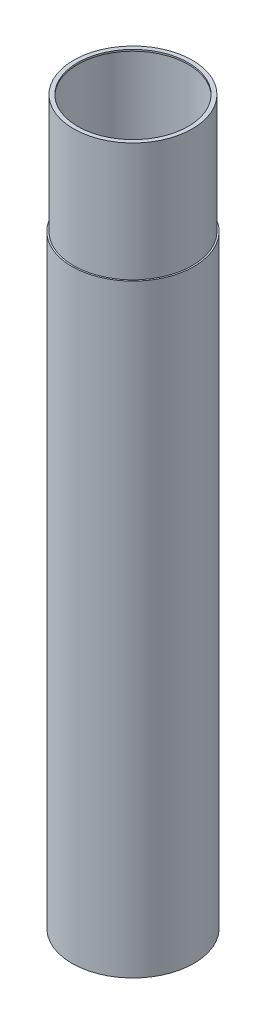
ISO-10303-21;
HEADER;
FILE_DESCRIPTION(('STEP AP214'),'2;1');
FILE_NAME('part.step','',(''),(''),'','','');
FILE_SCHEMA(('AUTOMOTIVE_DESIGN { 1 0 10303 214 1 1 1 1 }'));
ENDSEC;
DATA;
#1=APPLICATION_CONTEXT('core data for automotive mechanical design processes');
#2=APPLICATION_PROTOCOL_DEFINITION('international standard','automotive_design',2000,#1);
#3=PRODUCT_CONTEXT('',#1,'mechanical');
#4=PRODUCT('Part','Part','',(#3));
#5=PRODUCT_RELATED_PRODUCT_CATEGORY('part','',(#4));
#6=PRODUCT_DEFINITION_FORMATION('','',#4);
#7=PRODUCT_DEFINITION_CONTEXT('part definition',#1,'design');
#8=PRODUCT_DEFINITION('design','',#6,#7);
#9=PRODUCT_DEFINITION_SHAPE('','',#8);
#10=(LENGTH_UNIT() NAMED_UNIT(*) SI_UNIT(.MILLI.,.METRE.));
#11=(NAMED_UNIT(*) PLANE_ANGLE_UNIT() SI_UNIT($,.RADIAN.));
#12=(NAMED_UNIT(*) SI_UNIT($,.STERADIAN.) SOLID_ANGLE_UNIT());
#13=UNCERTAINTY_MEASURE_WITH_UNIT(LENGTH_MEASURE(1.E-05),#10,'distance_accuracy_value','');
#14=(GEOMETRIC_REPRESENTATION_CONTEXT(3) GLOBAL_UNCERTAINTY_ASSIGNED_CONTEXT((#13)) GLOBAL_UNIT_ASSIGNED_CONTEXT((#10,
#11,#12)) REPRESENTATION_CONTEXT('',''));
#15=CARTESIAN_POINT('',(0.,0.,0.));
#16=DIRECTION('',(0.,0.,1.));
#17=DIRECTION('',(1.,0.,0.));
#18=AXIS2_PLACEMENT_3D('',#15,#16,#17);
#19=CARTESIAN_POINT('',(0.,622.,0.));
#20=DIRECTION('',(0.,1.,0.));
#21=DIRECTION('',(0.,0.,1.));
#22=AXIS2_PLACEMENT_3D('',#19,#20,#21);
#23=CYLINDRICAL_SURFACE('',#22,75.2);
#24=CARTESIAN_POINT('',(0.,622.,0.));
#25=DIRECTION('',(0.,1.,0.));
#26=DIRECTION('',(0.,0.,1.));
#27=AXIS2_PLACEMENT_3D('',#24,#25,#26);
#28=CIRCLE('',#27,75.2);
#29=CARTESIAN_POINT('',(0.,622.,75.2));
#30=VERTEX_POINT('',#29);
#31=EDGE_CURVE('E71',#30,#30,#28,.T.);
#32=ORIENTED_EDGE('',*,*,#31,.F.);
#33=EDGE_LOOP('',(#32));
#34=FACE_BOUND('',#33,.T.);
#35=CARTESIAN_POINT('',(0.,924.,0.));
#36=DIRECTION('',(0.,1.,0.));
#37=DIRECTION('',(0.,0.,1.));
#38=AXIS2_PLACEMENT_3D('',#35,#36,#37);
#39=CIRCLE('',#38,75.2);
#40=CARTESIAN_POINT('',(0.,924.,75.2));
#41=VERTEX_POINT('',#40);
#42=EDGE_CURVE('E10',#41,#41,#39,.F.);
#43=ORIENTED_EDGE('',*,*,#42,.F.);
#44=EDGE_LOOP('',(#43));
#45=FACE_BOUND('',#44,.T.);
#46=ADVANCED_FACE('F39',(#34,#45),#23,.F.);
#47=CARTESIAN_POINT('',(0.,204.615384615384,0.));
#48=DIRECTION('',(0.,1.,0.));
#49=DIRECTION('',(0.,0.,1.));
#50=AXIS2_PLACEMENT_3D('',#47,#48,#49);
#51=CYLINDRICAL_SURFACE('',#50,76.2);
#52=CARTESIAN_POINT('',(0.,0.,0.));
#53=DIRECTION('',(0.,1.,0.));
#54=DIRECTION('',(0.,0.,1.));
#55=AXIS2_PLACEMENT_3D('',#52,#53,#54);
#56=CIRCLE('',#55,76.2);
#57=CARTESIAN_POINT('',(0.,0.,76.2));
#58=VERTEX_POINT('',#57);
#59=EDGE_CURVE('E67',#58,#58,#56,.T.);
#60=ORIENTED_EDGE('',*,*,#59,.F.);
#61=EDGE_LOOP('',(#60));
#62=FACE_BOUND('',#61,.T.);
#63=CARTESIAN_POINT('',(0.,622.,0.));
#64=DIRECTION('',(0.,1.,0.));
#65=DIRECTION('',(0.,0.,1.));
#66=AXIS2_PLACEMENT_3D('',#63,#64,#65);
#67=CIRCLE('',#66,76.2);
#68=CARTESIAN_POINT('',(0.,622.,76.2));
#69=VERTEX_POINT('',#68);
#70=EDGE_CURVE('E47',#69,#69,#67,.F.);
#71=ORIENTED_EDGE('',*,*,#70,.F.);
#72=EDGE_LOOP('',(#71));
#73=FACE_BOUND('',#72,.T.);
#74=ADVANCED_FACE('F111',(#62,#73),#51,.F.);
#75=CARTESIAN_POINT('',(76.2,0.,0.));
#76=DIRECTION('',(0.,1.,0.));
#77=DIRECTION('',(0.,0.,1.));
#78=AXIS2_PLACEMENT_3D('',#75,#76,#77);
#79=PLANE('',#78);
#80=CARTESIAN_POINT('',(0.,0.,0.));
#81=DIRECTION('',(0.,1.,0.));
#82=DIRECTION('',(0.,0.,1.));
#83=AXIS2_PLACEMENT_3D('',#80,#81,#82);
#84=CIRCLE('',#83,78.16);
#85=CARTESIAN_POINT('',(0.,0.,78.16));
#86=VERTEX_POINT('',#85);
#87=EDGE_CURVE('E52',#86,#86,#84,.T.);
#88=ORIENTED_EDGE('',*,*,#87,.F.);
#89=EDGE_LOOP('',(#88));
#90=FACE_BOUND('',#89,.T.);
#91=ORIENTED_EDGE('',*,*,#59,.T.);
#92=EDGE_LOOP('',(#91));
#93=FACE_BOUND('',#92,.T.);
#94=ADVANCED_FACE('F41',(#90,#93),#79,.F.);
#95=CARTESIAN_POINT('',(0.,204.615384615384,0.));
#96=DIRECTION('',(0.,1.,0.));
#97=DIRECTION('',(0.,0.,1.));
#98=AXIS2_PLACEMENT_3D('',#95,#96,#97);
#99=CYLINDRICAL_SURFACE('',#98,78.16);
#100=CARTESIAN_POINT('',(0.,774.,0.));
#101=DIRECTION('',(0.,1.,0.));
#102=DIRECTION('',(0.,0.,1.));
#103=AXIS2_PLACEMENT_3D('',#100,#101,#102);
#104=CIRCLE('',#103,78.16);
#105=CARTESIAN_POINT('',(0.,774.,78.16));
#106=VERTEX_POINT('',#105);
#107=EDGE_CURVE('E57',#106,#106,#104,.T.);
#108=ORIENTED_EDGE('',*,*,#107,.F.);
#109=EDGE_LOOP('',(#108));
#110=FACE_BOUND('',#109,.T.);
#111=ORIENTED_EDGE('',*,*,#87,.T.);
#112=EDGE_LOOP('',(#111));
#113=FACE_BOUND('',#112,.T.);
#114=ADVANCED_FACE('F126',(#110,#113),#99,.T.);
#115=CARTESIAN_POINT('',(78.16,774.,0.));
#116=DIRECTION('',(0.,-1.,0.));
#117=DIRECTION('',(0.,0.,-1.));
#118=AXIS2_PLACEMENT_3D('',#115,#116,#117);
#119=PLANE('',#118);
#120=CARTESIAN_POINT('',(0.,774.,0.));
#121=DIRECTION('',(0.,1.,0.));
#122=DIRECTION('',(0.,0.,1.));
#123=AXIS2_PLACEMENT_3D('',#120,#121,#122);
#124=CIRCLE('',#123,76.2);
#125=CARTESIAN_POINT('',(0.,774.,76.2));
#126=VERTEX_POINT('',#125);
#127=EDGE_CURVE('E63',#126,#126,#124,.T.);
#128=ORIENTED_EDGE('',*,*,#127,.F.);
#129=EDGE_LOOP('',(#128));
#130=FACE_BOUND('',#129,.T.);
#131=ORIENTED_EDGE('',*,*,#107,.T.);
#132=EDGE_LOOP('',(#131));
#133=FACE_BOUND('',#132,.T.);
#134=ADVANCED_FACE('F122',(#130,#133),#119,.F.);
#135=CARTESIAN_POINT('',(0.,622.,0.));
#136=DIRECTION('',(0.,1.,0.));
#137=DIRECTION('',(0.,0.,1.));
#138=AXIS2_PLACEMENT_3D('',#135,#136,#137);
#139=CYLINDRICAL_SURFACE('',#138,76.2);
#140=CARTESIAN_POINT('',(0.,926.,0.));
#141=DIRECTION('',(0.,1.,0.));
#142=DIRECTION('',(0.,0.,1.));
#143=AXIS2_PLACEMENT_3D('',#140,#141,#142);
#144=CIRCLE('',#143,76.2);
#145=CARTESIAN_POINT('',(0.,926.,76.2));
#146=VERTEX_POINT('',#145);
#147=EDGE_CURVE('E75',#146,#146,#144,.T.);
#148=ORIENTED_EDGE('',*,*,#147,.F.);
#149=EDGE_LOOP('',(#148));
#150=FACE_BOUND('',#149,.T.);
#151=ORIENTED_EDGE('',*,*,#127,.T.);
#152=EDGE_LOOP('',(#151));
#153=FACE_BOUND('',#152,.T.);
#154=ADVANCED_FACE('F106',(#150,#153),#139,.T.);
#155=CARTESIAN_POINT('',(0.,622.,0.));
#156=DIRECTION('',(0.,1.,0.));
#157=DIRECTION('',(0.,0.,1.));
#158=AXIS2_PLACEMENT_3D('',#155,#156,#157);
#159=PLANE('',#158);
#160=ORIENTED_EDGE('',*,*,#31,.T.);
#161=EDGE_LOOP('',(#160));
#162=FACE_BOUND('',#161,.T.);
#163=ORIENTED_EDGE('',*,*,#70,.T.);
#164=EDGE_LOOP('',(#163));
#165=FACE_BOUND('',#164,.T.);
#166=ADVANCED_FACE('F98',(#162,#165),#159,.F.);
#167=CARTESIAN_POINT('',(0.,926.,0.));
#168=DIRECTION('',(0.,1.,0.));
#169=DIRECTION('',(0.,0.,1.));
#170=AXIS2_PLACEMENT_3D('',#167,#168,#169);
#171=PLANE('',#170);
#172=ORIENTED_EDGE('',*,*,#147,.T.);
#173=EDGE_LOOP('',(#172));
#174=FACE_BOUND('',#173,.T.);
#175=CARTESIAN_POINT('',(0.,926.,0.));
#176=DIRECTION('',(0.,1.,0.));
#177=DIRECTION('',(0.,0.,1.));
#178=AXIS2_PLACEMENT_3D('',#175,#176,#177);
#179=CIRCLE('',#178,70.915017823714);
#180=CARTESIAN_POINT('',(0.,926.,70.915017823714));
#181=VERTEX_POINT('',#180);
#182=EDGE_CURVE('E80',#181,#181,#179,.T.);
#183=ORIENTED_EDGE('',*,*,#182,.F.);
#184=EDGE_LOOP('',(#183));
#185=FACE_BOUND('',#184,.T.);
#186=ADVANCED_FACE('F96',(#174,#185),#171,.T.);
#187=CARTESIAN_POINT('',(0.,924.,0.));
#188=DIRECTION('',(0.,1.,0.));
#189=DIRECTION('',(0.,0.,1.));
#190=AXIS2_PLACEMENT_3D('',#187,#188,#189);
#191=PLANE('',#190);
#192=CARTESIAN_POINT('',(0.,924.,0.));
#193=DIRECTION('',(0.,1.,0.));
#194=DIRECTION('',(0.,0.,1.));
#195=AXIS2_PLACEMENT_3D('',#192,#193,#194);
#196=CIRCLE('',#195,70.915017823714);
#197=CARTESIAN_POINT('',(0.,924.,70.915017823714));
#198=VERTEX_POINT('',#197);
#199=EDGE_CURVE('E79',#198,#198,#196,.T.);
#200=ORIENTED_EDGE('',*,*,#199,.T.);
#201=EDGE_LOOP('',(#200));
#202=FACE_BOUND('',#201,.T.);
#203=ORIENTED_EDGE('',*,*,#42,.T.);
#204=EDGE_LOOP('',(#203));
#205=FACE_BOUND('',#204,.T.);
#206=ADVANCED_FACE('F88',(#202,#205),#191,.F.);
#207=CARTESIAN_POINT('',(0.,924.,0.));
#208=DIRECTION('',(0.,1.,0.));
#209=DIRECTION('',(0.,0.,1.));
#210=AXIS2_PLACEMENT_3D('',#207,#208,#209);
#211=CYLINDRICAL_SURFACE('',#210,70.915017823714);
#212=ORIENTED_EDGE('',*,*,#199,.F.);
#213=EDGE_LOOP('',(#212));
#214=FACE_BOUND('',#213,.T.);
#215=ORIENTED_EDGE('',*,*,#182,.T.);
#216=EDGE_LOOP('',(#215));
#217=FACE_BOUND('',#216,.T.);
#218=ADVANCED_FACE('F90',(#214,#217),#211,.F.);
#219=CLOSED_SHELL('',(#46,#74,#94,#114,#134,#154,#166,#186,#206,#218));
#220=MANIFOLD_SOLID_BREP('B2',#219);
#221=ADVANCED_BREP_SHAPE_REPRESENTATION('',(#18,#220),#14);
#222=SHAPE_DEFINITION_REPRESENTATION(#9,#221);
ENDSEC;
END-ISO-10303-21;
